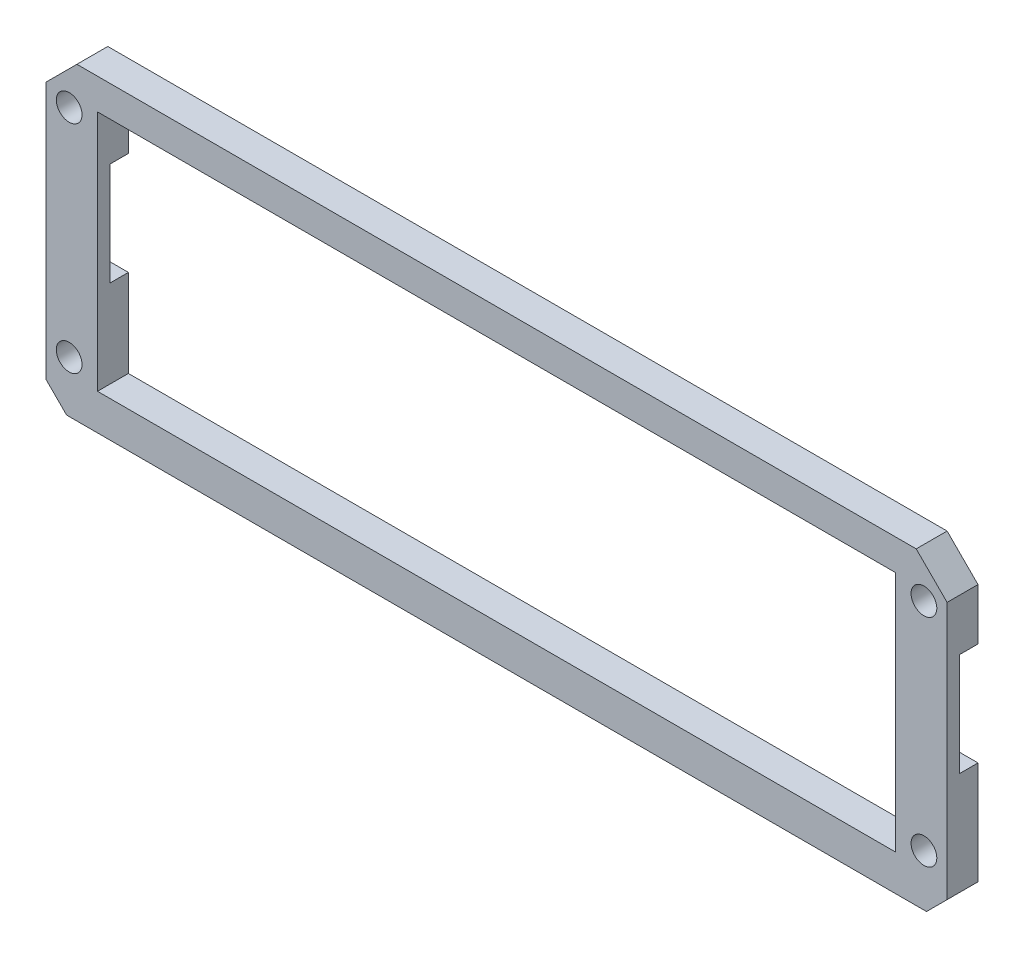
ISO-10303-21;
HEADER;
FILE_DESCRIPTION(('STEP AP214'),'2;1');
FILE_NAME('part.step','',(''),(''),'','','');
FILE_SCHEMA(('AUTOMOTIVE_DESIGN { 1 0 10303 214 1 1 1 1 }'));
ENDSEC;
DATA;
#1=APPLICATION_CONTEXT('core data for automotive mechanical design processes');
#2=APPLICATION_PROTOCOL_DEFINITION('international standard','automotive_design',2000,#1);
#3=PRODUCT_CONTEXT('',#1,'mechanical');
#4=PRODUCT('Part','Part','',(#3));
#5=PRODUCT_RELATED_PRODUCT_CATEGORY('part','',(#4));
#6=PRODUCT_DEFINITION_FORMATION('','',#4);
#7=PRODUCT_DEFINITION_CONTEXT('part definition',#1,'design');
#8=PRODUCT_DEFINITION('design','',#6,#7);
#9=PRODUCT_DEFINITION_SHAPE('','',#8);
#10=(LENGTH_UNIT() NAMED_UNIT(*) SI_UNIT(.MILLI.,.METRE.));
#11=(NAMED_UNIT(*) PLANE_ANGLE_UNIT() SI_UNIT($,.RADIAN.));
#12=(NAMED_UNIT(*) SI_UNIT($,.STERADIAN.) SOLID_ANGLE_UNIT());
#13=UNCERTAINTY_MEASURE_WITH_UNIT(LENGTH_MEASURE(1.E-05),#10,'distance_accuracy_value','');
#14=(GEOMETRIC_REPRESENTATION_CONTEXT(3) GLOBAL_UNCERTAINTY_ASSIGNED_CONTEXT((#13)) GLOBAL_UNIT_ASSIGNED_CONTEXT((#10,
#11,#12)) REPRESENTATION_CONTEXT('',''));
#15=CARTESIAN_POINT('',(0.,0.,0.));
#16=DIRECTION('',(0.,0.,1.));
#17=DIRECTION('',(1.,0.,0.));
#18=AXIS2_PLACEMENT_3D('',#15,#16,#17);
#19=CARTESIAN_POINT('',(-43.4837728194726,11.9998482681954,3.));
#20=DIRECTION('',(1.,0.,0.));
#21=DIRECTION('',(0.,1.,0.));
#22=AXIS2_PLACEMENT_3D('',#19,#20,#21);
#23=PLANE('',#22);
#24=DIRECTION('',(0.,-1.,0.));
#25=VECTOR('',#24,1.);
#26=CARTESIAN_POINT('',(-43.4837728194726,11.9998482681954,3.));
#27=LINE('',#26,#25);
#28=CARTESIAN_POINT('',(-43.4837728194726,8.99984826819537,3.));
#29=VERTEX_POINT('',#28);
#30=CARTESIAN_POINT('',(-43.4837728194726,-16.0001517318046,3.));
#31=VERTEX_POINT('',#30);
#32=EDGE_CURVE('E282',#29,#31,#27,.T.);
#33=ORIENTED_EDGE('',*,*,#32,.F.);
#34=DIRECTION('',(0.,0.,-1.));
#35=VECTOR('',#34,1.);
#36=CARTESIAN_POINT('',(-43.4837728194726,8.99984826819537,0.));
#37=LINE('',#36,#35);
#38=CARTESIAN_POINT('',(-43.4837728194726,8.99984826819537,0.));
#39=VERTEX_POINT('',#38);
#40=EDGE_CURVE('E11',#29,#39,#37,.T.);
#41=ORIENTED_EDGE('',*,*,#40,.T.);
#42=DIRECTION('',(0.,-1.,0.));
#43=VECTOR('',#42,1.);
#44=CARTESIAN_POINT('',(-43.4837728194726,11.9998482681954,0.));
#45=LINE('',#44,#43);
#46=CARTESIAN_POINT('',(-43.4837728194726,3.99984826819536,0.));
#47=VERTEX_POINT('',#46);
#48=EDGE_CURVE('E281',#39,#47,#45,.T.);
#49=ORIENTED_EDGE('',*,*,#48,.T.);
#50=DIRECTION('',(0.,0.,1.));
#51=VECTOR('',#50,1.);
#52=CARTESIAN_POINT('',(-43.4837728194726,3.99984826819536,3.));
#53=LINE('',#52,#51);
#54=CARTESIAN_POINT('',(-43.4837728194726,3.99984826819536,1.8));
#55=VERTEX_POINT('',#54);
#56=EDGE_CURVE('E314',#47,#55,#53,.T.);
#57=ORIENTED_EDGE('',*,*,#56,.T.);
#58=DIRECTION('',(0.,-1.,0.));
#59=VECTOR('',#58,1.);
#60=CARTESIAN_POINT('',(-43.4837728194726,11.9998482681954,1.8));
#61=LINE('',#60,#59);
#62=CARTESIAN_POINT('',(-43.4837728194726,-6.00015173180464,1.8));
#63=VERTEX_POINT('',#62);
#64=EDGE_CURVE('E309',#55,#63,#61,.T.);
#65=ORIENTED_EDGE('',*,*,#64,.T.);
#66=DIRECTION('',(0.,0.,-1.));
#67=VECTOR('',#66,1.);
#68=CARTESIAN_POINT('',(-43.4837728194726,-6.00015173180464,3.));
#69=LINE('',#68,#67);
#70=CARTESIAN_POINT('',(-43.4837728194726,-6.00015173180464,0.));
#71=VERTEX_POINT('',#70);
#72=EDGE_CURVE('E296',#63,#71,#69,.T.);
#73=ORIENTED_EDGE('',*,*,#72,.T.);
#74=CARTESIAN_POINT('',(-43.4837728194726,-16.0001517318046,0.));
#75=VERTEX_POINT('',#74);
#76=EDGE_CURVE('E283',#71,#75,#45,.T.);
#77=ORIENTED_EDGE('',*,*,#76,.T.);
#78=DIRECTION('',(0.,0.,1.));
#79=VECTOR('',#78,1.);
#80=CARTESIAN_POINT('',(-43.4837728194726,-16.0001517318046,3.));
#81=LINE('',#80,#79);
#82=EDGE_CURVE('E246',#75,#31,#81,.T.);
#83=ORIENTED_EDGE('',*,*,#82,.T.);
#84=EDGE_LOOP('',(#33,#41,#49,#57,#65,#73,#77,#83));
#85=FACE_BOUND('',#84,.T.);
#86=ADVANCED_FACE('F36',(#85),#23,.F.);
#87=CARTESIAN_POINT('',(44.0162271805274,11.9998482681954,3.));
#88=DIRECTION('',(-1.,0.,0.));
#89=DIRECTION('',(0.,-1.,0.));
#90=AXIS2_PLACEMENT_3D('',#87,#88,#89);
#91=PLANE('',#90);
#92=DIRECTION('',(0.,1.,0.));
#93=VECTOR('',#92,1.);
#94=CARTESIAN_POINT('',(44.0162271805274,11.9998482681954,0.));
#95=LINE('',#94,#93);
#96=CARTESIAN_POINT('',(44.0162271805274,3.99984826819536,0.));
#97=VERTEX_POINT('',#96);
#98=CARTESIAN_POINT('',(44.0162271805274,8.99984826819533,0.));
#99=VERTEX_POINT('',#98);
#100=EDGE_CURVE('E274',#97,#99,#95,.T.);
#101=ORIENTED_EDGE('',*,*,#100,.T.);
#102=DIRECTION('',(0.,0.,1.));
#103=VECTOR('',#102,1.);
#104=CARTESIAN_POINT('',(44.0162271805274,8.99984826819533,3.));
#105=LINE('',#104,#103);
#106=CARTESIAN_POINT('',(44.0162271805274,8.99984826819533,3.));
#107=VERTEX_POINT('',#106);
#108=EDGE_CURVE('E59',#99,#107,#105,.T.);
#109=ORIENTED_EDGE('',*,*,#108,.T.);
#110=DIRECTION('',(0.,1.,0.));
#111=VECTOR('',#110,1.);
#112=CARTESIAN_POINT('',(44.0162271805274,11.9998482681954,3.));
#113=LINE('',#112,#111);
#114=CARTESIAN_POINT('',(44.0162271805274,-16.0001517318046,3.));
#115=VERTEX_POINT('',#114);
#116=EDGE_CURVE('E264',#115,#107,#113,.T.);
#117=ORIENTED_EDGE('',*,*,#116,.F.);
#118=DIRECTION('',(0.,0.,-1.));
#119=VECTOR('',#118,1.);
#120=CARTESIAN_POINT('',(44.0162271805274,-16.0001517318046,0.));
#121=LINE('',#120,#119);
#122=CARTESIAN_POINT('',(44.0162271805274,-16.0001517318046,0.));
#123=VERTEX_POINT('',#122);
#124=EDGE_CURVE('E230',#115,#123,#121,.T.);
#125=ORIENTED_EDGE('',*,*,#124,.T.);
#126=CARTESIAN_POINT('',(44.0162271805274,-6.00015173180464,0.));
#127=VERTEX_POINT('',#126);
#128=EDGE_CURVE('E280',#123,#127,#95,.T.);
#129=ORIENTED_EDGE('',*,*,#128,.T.);
#130=DIRECTION('',(0.,0.,-1.));
#131=VECTOR('',#130,1.);
#132=CARTESIAN_POINT('',(44.0162271805274,-6.00015173180464,0.));
#133=LINE('',#132,#131);
#134=CARTESIAN_POINT('',(44.0162271805274,-6.00015173180464,1.8));
#135=VERTEX_POINT('',#134);
#136=EDGE_CURVE('E322',#135,#127,#133,.T.);
#137=ORIENTED_EDGE('',*,*,#136,.F.);
#138=DIRECTION('',(0.,-1.,0.));
#139=VECTOR('',#138,1.);
#140=CARTESIAN_POINT('',(44.0162271805274,3.99984826819536,1.8));
#141=LINE('',#140,#139);
#142=CARTESIAN_POINT('',(44.0162271805274,3.99984826819536,1.8));
#143=VERTEX_POINT('',#142);
#144=EDGE_CURVE('E334',#143,#135,#141,.T.);
#145=ORIENTED_EDGE('',*,*,#144,.F.);
#146=DIRECTION('',(0.,0.,1.));
#147=VECTOR('',#146,1.);
#148=CARTESIAN_POINT('',(44.0162271805274,3.99984826819536,0.));
#149=LINE('',#148,#147);
#150=EDGE_CURVE('E279',#97,#143,#149,.T.);
#151=ORIENTED_EDGE('',*,*,#150,.F.);
#152=EDGE_LOOP('',(#101,#109,#117,#125,#129,#137,#145,#151));
#153=FACE_BOUND('',#152,.T.);
#154=ADVANCED_FACE('F276',(#153),#91,.F.);
#155=CARTESIAN_POINT('',(0.,0.,3.));
#156=DIRECTION('',(0.,0.,1.));
#157=DIRECTION('',(1.,0.,0.));
#158=AXIS2_PLACEMENT_3D('',#155,#156,#157);
#159=PLANE('',#158);
#160=DIRECTION('',(0.,-1.,0.));
#161=VECTOR('',#160,1.);
#162=CARTESIAN_POINT('',(-38.4837728194726,11.9998482681954,3.));
#163=LINE('',#162,#161);
#164=CARTESIAN_POINT('',(-38.4837728194726,8.99984826819539,3.));
#165=VERTEX_POINT('',#164);
#166=CARTESIAN_POINT('',(-38.4837728194726,-14.5001517318046,3.));
#167=VERTEX_POINT('',#166);
#168=EDGE_CURVE('E223',#165,#167,#163,.T.);
#169=ORIENTED_EDGE('',*,*,#168,.F.);
#170=DIRECTION('',(-1.,0.,0.));
#171=VECTOR('',#170,1.);
#172=CARTESIAN_POINT('',(-38.4837728194726,8.99984826819539,3.));
#173=LINE('',#172,#171);
#174=CARTESIAN_POINT('',(39.0162271805274,8.99984826819537,3.));
#175=VERTEX_POINT('',#174);
#176=EDGE_CURVE('E192',#175,#165,#173,.T.);
#177=ORIENTED_EDGE('',*,*,#176,.F.);
#178=DIRECTION('',(0.,1.,0.));
#179=VECTOR('',#178,1.);
#180=CARTESIAN_POINT('',(39.0162271805274,11.9998482681954,3.));
#181=LINE('',#180,#179);
#182=CARTESIAN_POINT('',(39.0162271805274,-14.5001517318046,3.));
#183=VERTEX_POINT('',#182);
#184=EDGE_CURVE('E288',#183,#175,#181,.T.);
#185=ORIENTED_EDGE('',*,*,#184,.F.);
#186=DIRECTION('',(1.,0.,0.));
#187=VECTOR('',#186,1.);
#188=CARTESIAN_POINT('',(-38.4837728194726,-14.5001517318046,3.));
#189=LINE('',#188,#187);
#190=EDGE_CURVE('E350',#167,#183,#189,.T.);
#191=ORIENTED_EDGE('',*,*,#190,.F.);
#192=EDGE_LOOP('',(#169,#177,#185,#191));
#193=FACE_BOUND('',#192,.T.);
#194=CARTESIAN_POINT('',(-41.2337728194726,-13.0001517318046,3.));
#195=DIRECTION('',(0.,0.,1.));
#196=DIRECTION('',(1.,0.,0.));
#197=AXIS2_PLACEMENT_3D('',#194,#195,#196);
#198=CIRCLE('',#197,1.25000000000001);
#199=CARTESIAN_POINT('',(-39.9837728194726,-13.0001517318046,3.));
#200=VERTEX_POINT('',#199);
#201=EDGE_CURVE('E215',#200,#200,#198,.T.);
#202=ORIENTED_EDGE('',*,*,#201,.F.);
#203=EDGE_LOOP('',(#202));
#204=FACE_BOUND('',#203,.T.);
#205=CARTESIAN_POINT('',(-41.2337728194726,7.99984826819536,3.));
#206=DIRECTION('',(0.,0.,1.));
#207=DIRECTION('',(1.,0.,0.));
#208=AXIS2_PLACEMENT_3D('',#205,#206,#207);
#209=CIRCLE('',#208,1.25000000000001);
#210=CARTESIAN_POINT('',(-39.9837728194726,7.99984826819536,3.));
#211=VERTEX_POINT('',#210);
#212=EDGE_CURVE('E299',#211,#211,#209,.T.);
#213=ORIENTED_EDGE('',*,*,#212,.F.);
#214=EDGE_LOOP('',(#213));
#215=FACE_BOUND('',#214,.T.);
#216=CARTESIAN_POINT('',(41.7662271805274,-13.0001517318046,3.));
#217=DIRECTION('',(0.,0.,1.));
#218=DIRECTION('',(1.,0.,0.));
#219=AXIS2_PLACEMENT_3D('',#216,#217,#218);
#220=CIRCLE('',#219,1.25000000000001);
#221=CARTESIAN_POINT('',(43.0162271805274,-13.0001517318046,3.));
#222=VERTEX_POINT('',#221);
#223=EDGE_CURVE('E295',#222,#222,#220,.T.);
#224=ORIENTED_EDGE('',*,*,#223,.F.);
#225=EDGE_LOOP('',(#224));
#226=FACE_BOUND('',#225,.T.);
#227=CARTESIAN_POINT('',(41.7662271805274,7.99984826819536,3.));
#228=DIRECTION('',(0.,0.,1.));
#229=DIRECTION('',(1.,0.,0.));
#230=AXIS2_PLACEMENT_3D('',#227,#228,#229);
#231=CIRCLE('',#230,1.25000000000001);
#232=CARTESIAN_POINT('',(43.0162271805274,7.99984826819536,3.));
#233=VERTEX_POINT('',#232);
#234=EDGE_CURVE('E292',#233,#233,#231,.T.);
#235=ORIENTED_EDGE('',*,*,#234,.F.);
#236=EDGE_LOOP('',(#235));
#237=FACE_BOUND('',#236,.T.);
#238=ORIENTED_EDGE('',*,*,#116,.T.);
#239=DIRECTION('',(-0.707106781186546,0.707106781186549,0.));
#240=VECTOR('',#239,1.);
#241=CARTESIAN_POINT('',(26.5080377243615,26.5080377243613,3.));
#242=LINE('',#241,#240);
#243=CARTESIAN_POINT('',(41.0162271805274,11.9998482681954,3.));
#244=VERTEX_POINT('',#243);
#245=EDGE_CURVE('E44',#107,#244,#242,.T.);
#246=ORIENTED_EDGE('',*,*,#245,.T.);
#247=DIRECTION('',(1.,0.,0.));
#248=VECTOR('',#247,1.);
#249=CARTESIAN_POINT('',(-43.4837728194726,11.9998482681954,3.));
#250=LINE('',#249,#248);
#251=CARTESIAN_POINT('',(-40.4837728194726,11.9998482681954,3.));
#252=VERTEX_POINT('',#251);
#253=EDGE_CURVE('E263',#252,#244,#250,.T.);
#254=ORIENTED_EDGE('',*,*,#253,.F.);
#255=DIRECTION('',(-0.707106781186544,-0.707106781186551,0.));
#256=VECTOR('',#255,1.);
#257=CARTESIAN_POINT('',(-26.2418105438342,26.241810543834,3.));
#258=LINE('',#257,#256);
#259=EDGE_CURVE('E51',#252,#29,#258,.T.);
#260=ORIENTED_EDGE('',*,*,#259,.T.);
#261=ORIENTED_EDGE('',*,*,#32,.T.);
#262=DIRECTION('',(0.707106781186549,-0.707106781186546,0.));
#263=VECTOR('',#262,1.);
#264=CARTESIAN_POINT('',(-29.7419622756386,-29.7419622756387,3.));
#265=LINE('',#264,#263);
#266=CARTESIAN_POINT('',(-41.4837728194726,-18.0001517318046,3.));
#267=VERTEX_POINT('',#266);
#268=EDGE_CURVE('E242',#31,#267,#265,.T.);
#269=ORIENTED_EDGE('',*,*,#268,.T.);
#270=DIRECTION('',(-1.,0.,0.));
#271=VECTOR('',#270,1.);
#272=CARTESIAN_POINT('',(44.0162271805274,-18.0001517318046,3.));
#273=LINE('',#272,#271);
#274=CARTESIAN_POINT('',(42.0162271805274,-18.0001517318046,3.));
#275=VERTEX_POINT('',#274);
#276=EDGE_CURVE('E338',#275,#267,#273,.T.);
#277=ORIENTED_EDGE('',*,*,#276,.F.);
#278=DIRECTION('',(0.707106781186548,0.707106781186548,0.));
#279=VECTOR('',#278,1.);
#280=CARTESIAN_POINT('',(30.008189456166,-30.008189456166,3.));
#281=LINE('',#280,#279);
#282=EDGE_CURVE('E244',#275,#115,#281,.T.);
#283=ORIENTED_EDGE('',*,*,#282,.T.);
#284=EDGE_LOOP('',(#238,#246,#254,#260,#261,#269,#277,#283));
#285=FACE_BOUND('',#284,.T.);
#286=ADVANCED_FACE('F262',(#193,#204,#215,#226,#237,#285),#159,.T.);
#287=CARTESIAN_POINT('',(0.,0.,0.));
#288=DIRECTION('',(0.,0.,1.));
#289=DIRECTION('',(1.,0.,0.));
#290=AXIS2_PLACEMENT_3D('',#287,#288,#289);
#291=PLANE('',#290);
#292=CARTESIAN_POINT('',(41.7662271805274,7.99984826819536,0.));
#293=DIRECTION('',(0.,0.,1.));
#294=DIRECTION('',(1.,0.,0.));
#295=AXIS2_PLACEMENT_3D('',#292,#293,#294);
#296=CIRCLE('',#295,1.25000000000001);
#297=CARTESIAN_POINT('',(43.0162271805274,7.99984826819536,0.));
#298=VERTEX_POINT('',#297);
#299=EDGE_CURVE('E211',#298,#298,#296,.T.);
#300=ORIENTED_EDGE('',*,*,#299,.T.);
#301=EDGE_LOOP('',(#300));
#302=FACE_BOUND('',#301,.T.);
#303=CARTESIAN_POINT('',(-41.2337728194726,7.99984826819536,0.));
#304=DIRECTION('',(0.,0.,1.));
#305=DIRECTION('',(1.,0.,0.));
#306=AXIS2_PLACEMENT_3D('',#303,#304,#305);
#307=CIRCLE('',#306,1.25000000000001);
#308=CARTESIAN_POINT('',(-39.9837728194726,7.99984826819536,0.));
#309=VERTEX_POINT('',#308);
#310=EDGE_CURVE('E218',#309,#309,#307,.T.);
#311=ORIENTED_EDGE('',*,*,#310,.T.);
#312=EDGE_LOOP('',(#311));
#313=FACE_BOUND('',#312,.T.);
#314=DIRECTION('',(-1.,0.,0.));
#315=VECTOR('',#314,1.);
#316=CARTESIAN_POINT('',(-43.4837728194726,11.9998482681954,0.));
#317=LINE('',#316,#315);
#318=CARTESIAN_POINT('',(41.0162271805274,11.9998482681954,0.));
#319=VERTEX_POINT('',#318);
#320=CARTESIAN_POINT('',(-40.4837728194726,11.9998482681954,0.));
#321=VERTEX_POINT('',#320);
#322=EDGE_CURVE('E195',#319,#321,#317,.T.);
#323=ORIENTED_EDGE('',*,*,#322,.F.);
#324=DIRECTION('',(0.707106781186546,-0.707106781186549,0.));
#325=VECTOR('',#324,1.);
#326=CARTESIAN_POINT('',(41.0162271805274,11.9998482681954,0.));
#327=LINE('',#326,#325);
#328=EDGE_CURVE('E257',#319,#99,#327,.T.);
#329=ORIENTED_EDGE('',*,*,#328,.T.);
#330=ORIENTED_EDGE('',*,*,#100,.F.);
#331=DIRECTION('',(1.,0.,0.));
#332=VECTOR('',#331,1.);
#333=CARTESIAN_POINT('',(-47.9837728194726,3.99984826819536,0.));
#334=LINE('',#333,#332);
#335=CARTESIAN_POINT('',(39.0162271805274,3.99984826819536,0.));
#336=VERTEX_POINT('',#335);
#337=EDGE_CURVE('E319',#336,#97,#334,.T.);
#338=ORIENTED_EDGE('',*,*,#337,.F.);
#339=DIRECTION('',(0.,1.,0.));
#340=VECTOR('',#339,1.);
#341=CARTESIAN_POINT('',(39.0162271805274,0.,0.));
#342=LINE('',#341,#340);
#343=CARTESIAN_POINT('',(39.0162271805274,8.99984826819537,0.));
#344=VERTEX_POINT('',#343);
#345=EDGE_CURVE('E183',#336,#344,#342,.T.);
#346=ORIENTED_EDGE('',*,*,#345,.T.);
#347=DIRECTION('',(1.,0.,0.));
#348=VECTOR('',#347,1.);
#349=CARTESIAN_POINT('',(-38.4837728194726,8.99984826819539,0.));
#350=LINE('',#349,#348);
#351=CARTESIAN_POINT('',(-38.4837728194726,8.99984826819539,0.));
#352=VERTEX_POINT('',#351);
#353=EDGE_CURVE('E173',#352,#344,#350,.T.);
#354=ORIENTED_EDGE('',*,*,#353,.F.);
#355=DIRECTION('',(0.,-1.,0.));
#356=VECTOR('',#355,1.);
#357=CARTESIAN_POINT('',(-38.4837728194726,0.,0.));
#358=LINE('',#357,#356);
#359=CARTESIAN_POINT('',(-38.4837728194726,3.99984826819536,0.));
#360=VERTEX_POINT('',#359);
#361=EDGE_CURVE('E179',#352,#360,#358,.T.);
#362=ORIENTED_EDGE('',*,*,#361,.T.);
#363=EDGE_CURVE('E321',#47,#360,#334,.T.);
#364=ORIENTED_EDGE('',*,*,#363,.F.);
#365=ORIENTED_EDGE('',*,*,#48,.F.);
#366=DIRECTION('',(0.707106781186544,0.707106781186551,0.));
#367=VECTOR('',#366,1.);
#368=CARTESIAN_POINT('',(-40.4837728194726,11.9998482681954,0.));
#369=LINE('',#368,#367);
#370=EDGE_CURVE('E255',#39,#321,#369,.T.);
#371=ORIENTED_EDGE('',*,*,#370,.T.);
#372=EDGE_LOOP('',(#323,#329,#330,#338,#346,#354,#362,#364,#365,#371));
#373=FACE_BOUND('',#372,.T.);
#374=ADVANCED_FACE('F176',(#302,#313,#373),#291,.F.);
#375=ORIENTED_EDGE('',*,*,#128,.F.);
#376=DIRECTION('',(-0.707106781186548,-0.707106781186548,0.));
#377=VECTOR('',#376,1.);
#378=CARTESIAN_POINT('',(44.0162271805274,-16.0001517318046,0.));
#379=LINE('',#378,#377);
#380=CARTESIAN_POINT('',(42.0162271805274,-18.0001517318046,0.));
#381=VERTEX_POINT('',#380);
#382=EDGE_CURVE('E235',#123,#381,#379,.T.);
#383=ORIENTED_EDGE('',*,*,#382,.T.);
#384=DIRECTION('',(-1.,0.,0.));
#385=VECTOR('',#384,1.);
#386=CARTESIAN_POINT('',(44.0162271805274,-18.0001517318046,0.));
#387=LINE('',#386,#385);
#388=CARTESIAN_POINT('',(-41.4837728194726,-18.0001517318046,0.));
#389=VERTEX_POINT('',#388);
#390=EDGE_CURVE('E341',#381,#389,#387,.T.);
#391=ORIENTED_EDGE('',*,*,#390,.T.);
#392=DIRECTION('',(-0.707106781186549,0.707106781186546,0.));
#393=VECTOR('',#392,1.);
#394=CARTESIAN_POINT('',(-41.4837728194726,-18.0001517318046,0.));
#395=LINE('',#394,#393);
#396=EDGE_CURVE('E233',#389,#75,#395,.T.);
#397=ORIENTED_EDGE('',*,*,#396,.T.);
#398=ORIENTED_EDGE('',*,*,#76,.F.);
#399=DIRECTION('',(1.,0.,0.));
#400=VECTOR('',#399,1.);
#401=CARTESIAN_POINT('',(-47.9837728194726,-6.00015173180464,0.));
#402=LINE('',#401,#400);
#403=CARTESIAN_POINT('',(-38.4837728194726,-6.00015173180464,0.));
#404=VERTEX_POINT('',#403);
#405=EDGE_CURVE('E318',#71,#404,#402,.T.);
#406=ORIENTED_EDGE('',*,*,#405,.T.);
#407=CARTESIAN_POINT('',(-38.4837728194726,-14.5001517318046,0.));
#408=VERTEX_POINT('',#407);
#409=EDGE_CURVE('E202',#404,#408,#358,.T.);
#410=ORIENTED_EDGE('',*,*,#409,.T.);
#411=DIRECTION('',(-1.,0.,0.));
#412=VECTOR('',#411,1.);
#413=CARTESIAN_POINT('',(-38.4837728194726,-14.5001517318046,0.));
#414=LINE('',#413,#412);
#415=CARTESIAN_POINT('',(39.0162271805274,-14.5001517318046,0.));
#416=VERTEX_POINT('',#415);
#417=EDGE_CURVE('E344',#416,#408,#414,.T.);
#418=ORIENTED_EDGE('',*,*,#417,.F.);
#419=CARTESIAN_POINT('',(39.0162271805274,-6.00015173180464,0.));
#420=VERTEX_POINT('',#419);
#421=EDGE_CURVE('E207',#416,#420,#342,.T.);
#422=ORIENTED_EDGE('',*,*,#421,.T.);
#423=EDGE_CURVE('E329',#420,#127,#402,.T.);
#424=ORIENTED_EDGE('',*,*,#423,.T.);
#425=EDGE_LOOP('',(#375,#383,#391,#397,#398,#406,#410,#418,#422,#424));
#426=FACE_BOUND('',#425,.T.);
#427=CARTESIAN_POINT('',(-41.2337728194726,-13.0001517318046,0.));
#428=DIRECTION('',(0.,0.,1.));
#429=DIRECTION('',(1.,0.,0.));
#430=AXIS2_PLACEMENT_3D('',#427,#428,#429);
#431=CIRCLE('',#430,1.25000000000001);
#432=CARTESIAN_POINT('',(-39.9837728194726,-13.0001517318046,0.));
#433=VERTEX_POINT('',#432);
#434=EDGE_CURVE('E221',#433,#433,#431,.T.);
#435=ORIENTED_EDGE('',*,*,#434,.T.);
#436=EDGE_LOOP('',(#435));
#437=FACE_BOUND('',#436,.T.);
#438=CARTESIAN_POINT('',(41.7662271805274,-13.0001517318046,0.));
#439=DIRECTION('',(0.,0.,1.));
#440=DIRECTION('',(1.,0.,0.));
#441=AXIS2_PLACEMENT_3D('',#438,#439,#440);
#442=CIRCLE('',#441,1.25000000000001);
#443=CARTESIAN_POINT('',(43.0162271805274,-13.0001517318046,0.));
#444=VERTEX_POINT('',#443);
#445=EDGE_CURVE('E214',#444,#444,#442,.T.);
#446=ORIENTED_EDGE('',*,*,#445,.T.);
#447=EDGE_LOOP('',(#446));
#448=FACE_BOUND('',#447,.T.);
#449=ADVANCED_FACE('F382',(#426,#437,#448),#291,.F.);
#450=CARTESIAN_POINT('',(-38.4837728194726,11.9998482681954,-41.));
#451=DIRECTION('',(-1.,0.,0.));
#452=DIRECTION('',(0.,0.,1.));
#453=AXIS2_PLACEMENT_3D('',#450,#451,#452);
#454=PLANE('',#453);
#455=ORIENTED_EDGE('',*,*,#361,.F.);
#456=DIRECTION('',(0.,0.,-1.));
#457=VECTOR('',#456,1.);
#458=CARTESIAN_POINT('',(-38.4837728194726,8.99984826819539,3.));
#459=LINE('',#458,#457);
#460=EDGE_CURVE('E187',#165,#352,#459,.T.);
#461=ORIENTED_EDGE('',*,*,#460,.F.);
#462=ORIENTED_EDGE('',*,*,#168,.T.);
#463=DIRECTION('',(0.,0.,1.));
#464=VECTOR('',#463,1.);
#465=CARTESIAN_POINT('',(-38.4837728194726,-14.5001517318046,0.));
#466=LINE('',#465,#464);
#467=EDGE_CURVE('E353',#408,#167,#466,.T.);
#468=ORIENTED_EDGE('',*,*,#467,.F.);
#469=ORIENTED_EDGE('',*,*,#409,.F.);
#470=DIRECTION('',(0.,0.,1.));
#471=VECTOR('',#470,1.);
#472=CARTESIAN_POINT('',(-38.4837728194726,-6.00015173180464,-41.));
#473=LINE('',#472,#471);
#474=CARTESIAN_POINT('',(-38.4837728194726,-6.00015173180464,1.8));
#475=VERTEX_POINT('',#474);
#476=EDGE_CURVE('E306',#404,#475,#473,.T.);
#477=ORIENTED_EDGE('',*,*,#476,.T.);
#478=DIRECTION('',(0.,1.,0.));
#479=VECTOR('',#478,1.);
#480=CARTESIAN_POINT('',(-38.4837728194726,11.9998482681954,1.8));
#481=LINE('',#480,#479);
#482=CARTESIAN_POINT('',(-38.4837728194726,3.99984826819536,1.8));
#483=VERTEX_POINT('',#482);
#484=EDGE_CURVE('E312',#475,#483,#481,.T.);
#485=ORIENTED_EDGE('',*,*,#484,.T.);
#486=DIRECTION('',(0.,0.,-1.));
#487=VECTOR('',#486,1.);
#488=CARTESIAN_POINT('',(-38.4837728194726,3.99984826819536,-41.));
#489=LINE('',#488,#487);
#490=EDGE_CURVE('E200',#483,#360,#489,.T.);
#491=ORIENTED_EDGE('',*,*,#490,.T.);
#492=EDGE_LOOP('',(#455,#461,#462,#468,#469,#477,#485,#491));
#493=FACE_BOUND('',#492,.T.);
#494=ADVANCED_FACE('F198',(#493),#454,.F.);
#495=CARTESIAN_POINT('',(39.0162271805274,11.9998482681954,-41.));
#496=DIRECTION('',(1.,0.,0.));
#497=DIRECTION('',(0.,0.,-1.));
#498=AXIS2_PLACEMENT_3D('',#495,#496,#497);
#499=PLANE('',#498);
#500=ORIENTED_EDGE('',*,*,#184,.T.);
#501=DIRECTION('',(0.,0.,1.));
#502=VECTOR('',#501,1.);
#503=CARTESIAN_POINT('',(39.0162271805274,8.99984826819537,3.));
#504=LINE('',#503,#502);
#505=EDGE_CURVE('E186',#344,#175,#504,.T.);
#506=ORIENTED_EDGE('',*,*,#505,.F.);
#507=ORIENTED_EDGE('',*,*,#345,.F.);
#508=DIRECTION('',(0.,0.,1.));
#509=VECTOR('',#508,1.);
#510=CARTESIAN_POINT('',(39.0162271805274,3.99984826819536,-41.));
#511=LINE('',#510,#509);
#512=CARTESIAN_POINT('',(39.0162271805274,3.99984826819536,1.8));
#513=VERTEX_POINT('',#512);
#514=EDGE_CURVE('E201',#336,#513,#511,.T.);
#515=ORIENTED_EDGE('',*,*,#514,.T.);
#516=DIRECTION('',(0.,-1.,0.));
#517=VECTOR('',#516,1.);
#518=CARTESIAN_POINT('',(39.0162271805274,11.9998482681954,1.8));
#519=LINE('',#518,#517);
#520=CARTESIAN_POINT('',(39.0162271805274,-6.00015173180464,1.8));
#521=VERTEX_POINT('',#520);
#522=EDGE_CURVE('E205',#513,#521,#519,.T.);
#523=ORIENTED_EDGE('',*,*,#522,.T.);
#524=DIRECTION('',(0.,0.,-1.));
#525=VECTOR('',#524,1.);
#526=CARTESIAN_POINT('',(39.0162271805274,-6.00015173180464,-41.));
#527=LINE('',#526,#525);
#528=EDGE_CURVE('E227',#521,#420,#527,.T.);
#529=ORIENTED_EDGE('',*,*,#528,.T.);
#530=ORIENTED_EDGE('',*,*,#421,.F.);
#531=DIRECTION('',(0.,0.,-1.));
#532=VECTOR('',#531,1.);
#533=CARTESIAN_POINT('',(39.0162271805274,-14.5001517318046,0.));
#534=LINE('',#533,#532);
#535=EDGE_CURVE('E347',#183,#416,#534,.T.);
#536=ORIENTED_EDGE('',*,*,#535,.F.);
#537=EDGE_LOOP('',(#500,#506,#507,#515,#523,#529,#530,#536));
#538=FACE_BOUND('',#537,.T.);
#539=ADVANCED_FACE('F404',(#538),#499,.F.);
#540=CARTESIAN_POINT('',(41.7662271805274,7.99984826819536,-41.));
#541=DIRECTION('',(0.,0.,1.));
#542=DIRECTION('',(1.,0.,0.));
#543=AXIS2_PLACEMENT_3D('',#540,#541,#542);
#544=CYLINDRICAL_SURFACE('',#543,1.25000000000001);
#545=ORIENTED_EDGE('',*,*,#234,.T.);
#546=EDGE_LOOP('',(#545));
#547=FACE_BOUND('',#546,.T.);
#548=ORIENTED_EDGE('',*,*,#299,.F.);
#549=EDGE_LOOP('',(#548));
#550=FACE_BOUND('',#549,.T.);
#551=ADVANCED_FACE('F552',(#547,#550),#544,.F.);
#552=CARTESIAN_POINT('',(41.7662271805274,-13.0001517318046,-41.));
#553=DIRECTION('',(0.,0.,1.));
#554=DIRECTION('',(1.,0.,0.));
#555=AXIS2_PLACEMENT_3D('',#552,#553,#554);
#556=CYLINDRICAL_SURFACE('',#555,1.25000000000001);
#557=ORIENTED_EDGE('',*,*,#223,.T.);
#558=EDGE_LOOP('',(#557));
#559=FACE_BOUND('',#558,.T.);
#560=ORIENTED_EDGE('',*,*,#445,.F.);
#561=EDGE_LOOP('',(#560));
#562=FACE_BOUND('',#561,.T.);
#563=ADVANCED_FACE('F542',(#559,#562),#556,.F.);
#564=CARTESIAN_POINT('',(-41.2337728194726,7.99984826819536,-41.));
#565=DIRECTION('',(0.,0.,1.));
#566=DIRECTION('',(1.,0.,0.));
#567=AXIS2_PLACEMENT_3D('',#564,#565,#566);
#568=CYLINDRICAL_SURFACE('',#567,1.25000000000001);
#569=ORIENTED_EDGE('',*,*,#212,.T.);
#570=EDGE_LOOP('',(#569));
#571=FACE_BOUND('',#570,.T.);
#572=ORIENTED_EDGE('',*,*,#310,.F.);
#573=EDGE_LOOP('',(#572));
#574=FACE_BOUND('',#573,.T.);
#575=ADVANCED_FACE('F532',(#571,#574),#568,.F.);
#576=CARTESIAN_POINT('',(-41.2337728194726,-13.0001517318046,-41.));
#577=DIRECTION('',(0.,0.,1.));
#578=DIRECTION('',(1.,0.,0.));
#579=AXIS2_PLACEMENT_3D('',#576,#577,#578);
#580=CYLINDRICAL_SURFACE('',#579,1.25000000000001);
#581=ORIENTED_EDGE('',*,*,#201,.T.);
#582=EDGE_LOOP('',(#581));
#583=FACE_BOUND('',#582,.T.);
#584=ORIENTED_EDGE('',*,*,#434,.F.);
#585=EDGE_LOOP('',(#584));
#586=FACE_BOUND('',#585,.T.);
#587=ADVANCED_FACE('F524',(#583,#586),#580,.F.);
#588=CARTESIAN_POINT('',(-47.9837728194726,3.99984826819536,0.));
#589=DIRECTION('',(0.,1.,0.));
#590=DIRECTION('',(0.,0.,1.));
#591=AXIS2_PLACEMENT_3D('',#588,#589,#590);
#592=PLANE('',#591);
#593=ORIENTED_EDGE('',*,*,#337,.T.);
#594=ORIENTED_EDGE('',*,*,#150,.T.);
#595=DIRECTION('',(1.,0.,0.));
#596=VECTOR('',#595,1.);
#597=CARTESIAN_POINT('',(-47.9837728194726,3.99984826819536,1.8));
#598=LINE('',#597,#596);
#599=EDGE_CURVE('E323',#513,#143,#598,.T.);
#600=ORIENTED_EDGE('',*,*,#599,.F.);
#601=ORIENTED_EDGE('',*,*,#514,.F.);
#602=EDGE_LOOP('',(#593,#594,#600,#601));
#603=FACE_BOUND('',#602,.T.);
#604=ADVANCED_FACE('F410',(#603),#592,.F.);
#605=CARTESIAN_POINT('',(-47.9837728194726,3.99984826819536,1.8));
#606=DIRECTION('',(0.,0.,1.));
#607=DIRECTION('',(0.,-1.,0.));
#608=AXIS2_PLACEMENT_3D('',#605,#606,#607);
#609=PLANE('',#608);
#610=ORIENTED_EDGE('',*,*,#599,.T.);
#611=ORIENTED_EDGE('',*,*,#144,.T.);
#612=DIRECTION('',(1.,0.,0.));
#613=VECTOR('',#612,1.);
#614=CARTESIAN_POINT('',(-47.9837728194726,-6.00015173180464,1.8));
#615=LINE('',#614,#613);
#616=EDGE_CURVE('E326',#521,#135,#615,.T.);
#617=ORIENTED_EDGE('',*,*,#616,.F.);
#618=ORIENTED_EDGE('',*,*,#522,.F.);
#619=EDGE_LOOP('',(#610,#611,#617,#618));
#620=FACE_BOUND('',#619,.T.);
#621=ADVANCED_FACE('F408',(#620),#609,.F.);
#622=CARTESIAN_POINT('',(-47.9837728194726,-6.00015173180464,0.));
#623=DIRECTION('',(0.,-1.,0.));
#624=DIRECTION('',(0.,0.,-1.));
#625=AXIS2_PLACEMENT_3D('',#622,#623,#624);
#626=PLANE('',#625);
#627=ORIENTED_EDGE('',*,*,#616,.T.);
#628=ORIENTED_EDGE('',*,*,#136,.T.);
#629=ORIENTED_EDGE('',*,*,#423,.F.);
#630=ORIENTED_EDGE('',*,*,#528,.F.);
#631=EDGE_LOOP('',(#627,#628,#629,#630));
#632=FACE_BOUND('',#631,.T.);
#633=ADVANCED_FACE('F401',(#632),#626,.F.);
#634=EDGE_CURVE('E328',#63,#475,#615,.T.);
#635=ORIENTED_EDGE('',*,*,#634,.T.);
#636=ORIENTED_EDGE('',*,*,#476,.F.);
#637=ORIENTED_EDGE('',*,*,#405,.F.);
#638=ORIENTED_EDGE('',*,*,#72,.F.);
#639=EDGE_LOOP('',(#635,#636,#637,#638));
#640=FACE_BOUND('',#639,.T.);
#641=ADVANCED_FACE('F375',(#640),#626,.F.);
#642=EDGE_CURVE('E325',#55,#483,#598,.T.);
#643=ORIENTED_EDGE('',*,*,#642,.T.);
#644=ORIENTED_EDGE('',*,*,#484,.F.);
#645=ORIENTED_EDGE('',*,*,#634,.F.);
#646=ORIENTED_EDGE('',*,*,#64,.F.);
#647=EDGE_LOOP('',(#643,#644,#645,#646));
#648=FACE_BOUND('',#647,.T.);
#649=ADVANCED_FACE('F372',(#648),#609,.F.);
#650=ORIENTED_EDGE('',*,*,#363,.T.);
#651=ORIENTED_EDGE('',*,*,#490,.F.);
#652=ORIENTED_EDGE('',*,*,#642,.F.);
#653=ORIENTED_EDGE('',*,*,#56,.F.);
#654=EDGE_LOOP('',(#650,#651,#652,#653));
#655=FACE_BOUND('',#654,.T.);
#656=ADVANCED_FACE('F365',(#655),#592,.F.);
#657=CARTESIAN_POINT('',(44.0162271805274,-18.0001517318046,90.5514134666026));
#658=DIRECTION('',(0.,-1.,0.));
#659=DIRECTION('',(0.,0.,-1.));
#660=AXIS2_PLACEMENT_3D('',#657,#658,#659);
#661=PLANE('',#660);
#662=ORIENTED_EDGE('',*,*,#390,.F.);
#663=DIRECTION('',(0.,0.,1.));
#664=VECTOR('',#663,1.);
#665=CARTESIAN_POINT('',(42.0162271805274,-18.0001517318046,3.));
#666=LINE('',#665,#664);
#667=EDGE_CURVE('E240',#381,#275,#666,.T.);
#668=ORIENTED_EDGE('',*,*,#667,.T.);
#669=ORIENTED_EDGE('',*,*,#276,.T.);
#670=DIRECTION('',(0.,0.,-1.));
#671=VECTOR('',#670,1.);
#672=CARTESIAN_POINT('',(-41.4837728194726,-18.0001517318046,0.));
#673=LINE('',#672,#671);
#674=EDGE_CURVE('E237',#267,#389,#673,.T.);
#675=ORIENTED_EDGE('',*,*,#674,.T.);
#676=EDGE_LOOP('',(#662,#668,#669,#675));
#677=FACE_BOUND('',#676,.T.);
#678=ADVANCED_FACE('F394',(#677),#661,.T.);
#679=CARTESIAN_POINT('',(0.,-14.5001517318046,0.));
#680=DIRECTION('',(0.,1.,0.));
#681=DIRECTION('',(-1.,0.,0.));
#682=AXIS2_PLACEMENT_3D('',#679,#680,#681);
#683=PLANE('',#682);
#684=ORIENTED_EDGE('',*,*,#467,.T.);
#685=ORIENTED_EDGE('',*,*,#190,.T.);
#686=ORIENTED_EDGE('',*,*,#535,.T.);
#687=ORIENTED_EDGE('',*,*,#417,.T.);
#688=EDGE_LOOP('',(#684,#685,#686,#687));
#689=FACE_BOUND('',#688,.T.);
#690=ADVANCED_FACE('F415',(#689),#683,.T.);
#691=CARTESIAN_POINT('',(44.0162271805274,-16.0001517318046,3.));
#692=DIRECTION('',(0.707106781186547,-0.707106781186547,0.));
#693=DIRECTION('',(0.,0.,1.));
#694=AXIS2_PLACEMENT_3D('',#691,#692,#693);
#695=PLANE('',#694);
#696=ORIENTED_EDGE('',*,*,#282,.F.);
#697=ORIENTED_EDGE('',*,*,#667,.F.);
#698=ORIENTED_EDGE('',*,*,#382,.F.);
#699=ORIENTED_EDGE('',*,*,#124,.F.);
#700=EDGE_LOOP('',(#696,#697,#698,#699));
#701=FACE_BOUND('',#700,.T.);
#702=ADVANCED_FACE('F397',(#701),#695,.T.);
#703=CARTESIAN_POINT('',(-41.4837728194726,-18.0001517318046,90.5514134666026));
#704=DIRECTION('',(-0.707106781186546,-0.707106781186549,0.));
#705=DIRECTION('',(0.,0.,1.));
#706=AXIS2_PLACEMENT_3D('',#703,#704,#705);
#707=PLANE('',#706);
#708=ORIENTED_EDGE('',*,*,#268,.F.);
#709=ORIENTED_EDGE('',*,*,#82,.F.);
#710=ORIENTED_EDGE('',*,*,#396,.F.);
#711=ORIENTED_EDGE('',*,*,#674,.F.);
#712=EDGE_LOOP('',(#708,#709,#710,#711));
#713=FACE_BOUND('',#712,.T.);
#714=ADVANCED_FACE('F388',(#713),#707,.T.);
#715=CARTESIAN_POINT('',(0.,8.99984826819538,0.));
#716=DIRECTION('',(0.,-1.,0.));
#717=DIRECTION('',(0.,0.,-1.));
#718=AXIS2_PLACEMENT_3D('',#715,#716,#717);
#719=PLANE('',#718);
#720=ORIENTED_EDGE('',*,*,#460,.T.);
#721=ORIENTED_EDGE('',*,*,#353,.T.);
#722=ORIENTED_EDGE('',*,*,#505,.T.);
#723=ORIENTED_EDGE('',*,*,#176,.T.);
#724=EDGE_LOOP('',(#720,#721,#722,#723));
#725=FACE_BOUND('',#724,.T.);
#726=ADVANCED_FACE('F190',(#725),#719,.T.);
#727=CARTESIAN_POINT('',(0.,11.9998482681954,0.));
#728=DIRECTION('',(0.,1.,0.));
#729=DIRECTION('',(-1.,0.,0.));
#730=AXIS2_PLACEMENT_3D('',#727,#728,#729);
#731=PLANE('',#730);
#732=ORIENTED_EDGE('',*,*,#253,.T.);
#733=DIRECTION('',(0.,0.,-1.));
#734=VECTOR('',#733,1.);
#735=CARTESIAN_POINT('',(41.0162271805274,11.9998482681954,0.));
#736=LINE('',#735,#734);
#737=EDGE_CURVE('E252',#244,#319,#736,.T.);
#738=ORIENTED_EDGE('',*,*,#737,.T.);
#739=ORIENTED_EDGE('',*,*,#322,.T.);
#740=DIRECTION('',(0.,0.,1.));
#741=VECTOR('',#740,1.);
#742=CARTESIAN_POINT('',(-40.4837728194726,11.9998482681954,3.));
#743=LINE('',#742,#741);
#744=EDGE_CURVE('E249',#321,#252,#743,.T.);
#745=ORIENTED_EDGE('',*,*,#744,.T.);
#746=EDGE_LOOP('',(#732,#738,#739,#745));
#747=FACE_BOUND('',#746,.T.);
#748=ADVANCED_FACE('F268',(#747),#731,.T.);
#749=CARTESIAN_POINT('',(41.0162271805274,11.9998482681954,0.));
#750=DIRECTION('',(0.707106781186549,0.707106781186546,0.));
#751=DIRECTION('',(0.,0.,1.));
#752=AXIS2_PLACEMENT_3D('',#749,#750,#751);
#753=PLANE('',#752);
#754=ORIENTED_EDGE('',*,*,#245,.F.);
#755=ORIENTED_EDGE('',*,*,#108,.F.);
#756=ORIENTED_EDGE('',*,*,#328,.F.);
#757=ORIENTED_EDGE('',*,*,#737,.F.);
#758=EDGE_LOOP('',(#754,#755,#756,#757));
#759=FACE_BOUND('',#758,.T.);
#760=ADVANCED_FACE('F272',(#759),#753,.T.);
#761=CARTESIAN_POINT('',(-40.4837728194726,11.9998482681954,0.));
#762=DIRECTION('',(-0.707106781186551,0.707106781186544,0.));
#763=DIRECTION('',(0.,0.,-1.));
#764=AXIS2_PLACEMENT_3D('',#761,#762,#763);
#765=PLANE('',#764);
#766=ORIENTED_EDGE('',*,*,#370,.F.);
#767=ORIENTED_EDGE('',*,*,#40,.F.);
#768=ORIENTED_EDGE('',*,*,#259,.F.);
#769=ORIENTED_EDGE('',*,*,#744,.F.);
#770=EDGE_LOOP('',(#766,#767,#768,#769));
#771=FACE_BOUND('',#770,.T.);
#772=ADVANCED_FACE('F38',(#771),#765,.T.);
#773=CLOSED_SHELL('',(#86,#154,#286,#374,#449,#494,#539,#551,#563,#575,#587,#604,#621,#633,#641,
#649,#656,#678,#690,#702,#714,#726,#748,#760,#772));
#774=MANIFOLD_SOLID_BREP('B2',#773);
#775=ADVANCED_BREP_SHAPE_REPRESENTATION('',(#18,#774),#14);
#776=SHAPE_DEFINITION_REPRESENTATION(#9,#775);
ENDSEC;
END-ISO-10303-21;
